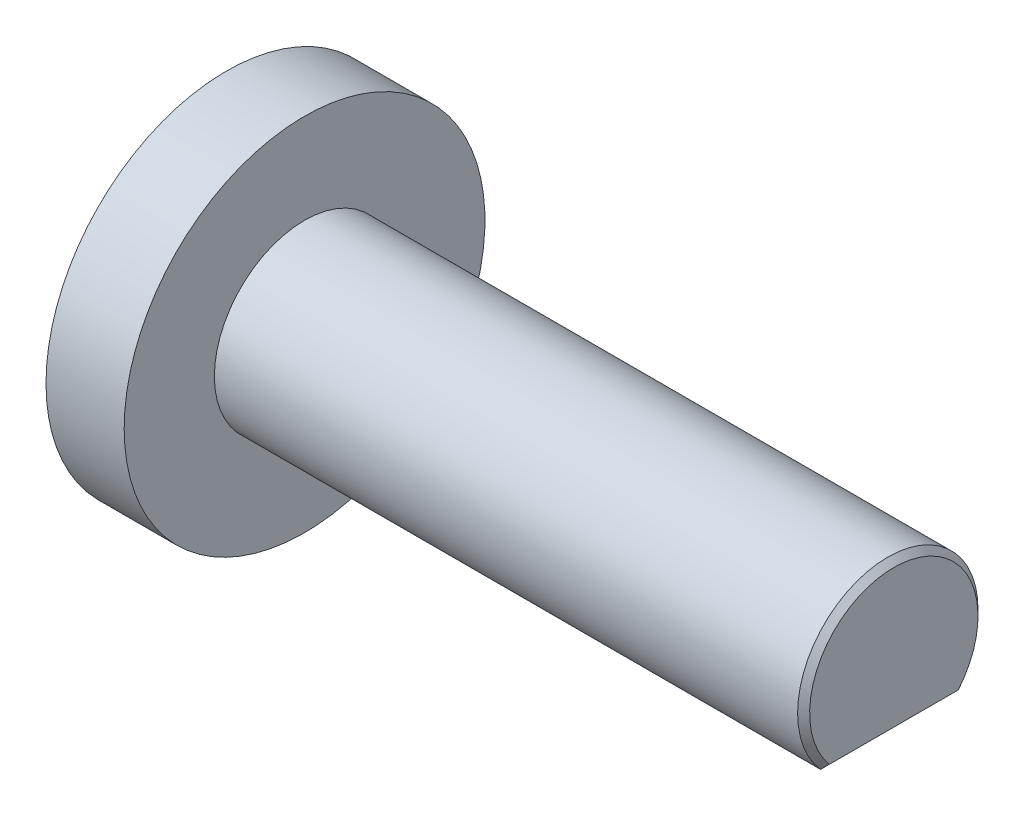
ISO-10303-21;
HEADER;
FILE_DESCRIPTION(('STEP AP214'),'2;1');
FILE_NAME('part.step','',(''),(''),'','','');
FILE_SCHEMA(('AUTOMOTIVE_DESIGN { 1 0 10303 214 1 1 1 1 }'));
ENDSEC;
DATA;
#1=APPLICATION_CONTEXT('core data for automotive mechanical design processes');
#2=APPLICATION_PROTOCOL_DEFINITION('international standard','automotive_design',2000,#1);
#3=PRODUCT_CONTEXT('',#1,'mechanical');
#4=PRODUCT('Part','Part','',(#3));
#5=PRODUCT_RELATED_PRODUCT_CATEGORY('part','',(#4));
#6=PRODUCT_DEFINITION_FORMATION('','',#4);
#7=PRODUCT_DEFINITION_CONTEXT('part definition',#1,'design');
#8=PRODUCT_DEFINITION('design','',#6,#7);
#9=PRODUCT_DEFINITION_SHAPE('','',#8);
#10=(LENGTH_UNIT() NAMED_UNIT(*) SI_UNIT(.MILLI.,.METRE.));
#11=(NAMED_UNIT(*) PLANE_ANGLE_UNIT() SI_UNIT($,.RADIAN.));
#12=(NAMED_UNIT(*) SI_UNIT($,.STERADIAN.) SOLID_ANGLE_UNIT());
#13=UNCERTAINTY_MEASURE_WITH_UNIT(LENGTH_MEASURE(1.E-05),#10,'distance_accuracy_value','');
#14=(GEOMETRIC_REPRESENTATION_CONTEXT(3) GLOBAL_UNCERTAINTY_ASSIGNED_CONTEXT((#13)) GLOBAL_UNIT_ASSIGNED_CONTEXT((#10,
#11,#12)) REPRESENTATION_CONTEXT('',''));
#15=CARTESIAN_POINT('',(0.,0.,0.));
#16=DIRECTION('',(0.,0.,1.));
#17=DIRECTION('',(1.,0.,0.));
#18=AXIS2_PLACEMENT_3D('',#15,#16,#17);
#19=CARTESIAN_POINT('',(0.,0.,0.));
#20=DIRECTION('',(1.,0.,0.));
#21=DIRECTION('',(0.,0.,-1.));
#22=AXIS2_PLACEMENT_3D('',#19,#20,#21);
#23=PLANE('',#22);
#24=CARTESIAN_POINT('',(0.,0.,0.));
#25=DIRECTION('',(-1.,0.,0.));
#26=DIRECTION('',(0.,0.,1.));
#27=AXIS2_PLACEMENT_3D('',#24,#25,#26);
#28=CIRCLE('',#27,3.);
#29=CARTESIAN_POINT('',(0.,0.,3.));
#30=VERTEX_POINT('',#29);
#31=EDGE_CURVE('E82',#30,#30,#28,.T.);
#32=ORIENTED_EDGE('',*,*,#31,.T.);
#33=EDGE_LOOP('',(#32));
#34=FACE_BOUND('',#33,.T.);
#35=ADVANCED_FACE('F33',(#34),#23,.F.);
#36=CARTESIAN_POINT('',(0.,0.,0.));
#37=DIRECTION('',(-1.,0.,0.));
#38=DIRECTION('',(0.,0.,1.));
#39=AXIS2_PLACEMENT_3D('',#36,#37,#38);
#40=CYLINDRICAL_SURFACE('',#39,3.);
#41=ORIENTED_EDGE('',*,*,#31,.F.);
#42=EDGE_LOOP('',(#41));
#43=FACE_BOUND('',#42,.T.);
#44=CARTESIAN_POINT('',(1.3,0.,0.));
#45=DIRECTION('',(-1.,0.,0.));
#46=DIRECTION('',(0.,0.,1.));
#47=AXIS2_PLACEMENT_3D('',#44,#45,#46);
#48=CIRCLE('',#47,3.);
#49=CARTESIAN_POINT('',(1.3,0.,3.));
#50=VERTEX_POINT('',#49);
#51=EDGE_CURVE('E98',#50,#50,#48,.T.);
#52=ORIENTED_EDGE('',*,*,#51,.T.);
#53=EDGE_LOOP('',(#52));
#54=FACE_BOUND('',#53,.T.);
#55=ADVANCED_FACE('F118',(#43,#54),#40,.T.);
#56=CARTESIAN_POINT('',(1.3,3.,0.));
#57=DIRECTION('',(-1.,0.,0.));
#58=DIRECTION('',(0.,0.,1.));
#59=AXIS2_PLACEMENT_3D('',#56,#57,#58);
#60=PLANE('',#59);
#61=ORIENTED_EDGE('',*,*,#51,.F.);
#62=EDGE_LOOP('',(#61));
#63=FACE_BOUND('',#62,.T.);
#64=CARTESIAN_POINT('',(1.3,0.,0.));
#65=DIRECTION('',(-1.,0.,0.));
#66=DIRECTION('',(0.,0.,1.));
#67=AXIS2_PLACEMENT_3D('',#64,#65,#66);
#68=CIRCLE('',#67,1.5);
#69=CARTESIAN_POINT('',(1.3,0.,1.5));
#70=VERTEX_POINT('',#69);
#71=EDGE_CURVE('E93',#70,#70,#68,.T.);
#72=ORIENTED_EDGE('',*,*,#71,.T.);
#73=EDGE_LOOP('',(#72));
#74=FACE_BOUND('',#73,.T.);
#75=ADVANCED_FACE('F122',(#63,#74),#60,.F.);
#76=CARTESIAN_POINT('',(0.,0.,0.));
#77=DIRECTION('',(-1.,0.,0.));
#78=DIRECTION('',(0.,0.,1.));
#79=AXIS2_PLACEMENT_3D('',#76,#77,#78);
#80=CYLINDRICAL_SURFACE('',#79,1.5);
#81=ORIENTED_EDGE('',*,*,#71,.F.);
#82=EDGE_LOOP('',(#81));
#83=FACE_BOUND('',#82,.T.);
#84=DIRECTION('',(1.,0.,0.));
#85=VECTOR('',#84,1.);
#86=CARTESIAN_POINT('',(2.1,-1.,1.1180339887499));
#87=LINE('',#86,#85);
#88=CARTESIAN_POINT('',(2.1,-1.,1.1180339887499));
#89=VERTEX_POINT('',#88);
#90=CARTESIAN_POINT('',(11.,-1.,1.1180339887499));
#91=VERTEX_POINT('',#90);
#92=EDGE_CURVE('E88',#89,#91,#87,.T.);
#93=ORIENTED_EDGE('',*,*,#92,.T.);
#94=CARTESIAN_POINT('',(11.,0.,0.));
#95=DIRECTION('',(-1.,0.,0.));
#96=DIRECTION('',(0.,0.,1.));
#97=AXIS2_PLACEMENT_3D('',#94,#95,#96);
#98=CIRCLE('',#97,1.5);
#99=CARTESIAN_POINT('',(11.,-1.,-1.1180339887499));
#100=VERTEX_POINT('',#99);
#101=EDGE_CURVE('E81',#91,#100,#98,.T.);
#102=ORIENTED_EDGE('',*,*,#101,.T.);
#103=DIRECTION('',(1.,0.,0.));
#104=VECTOR('',#103,1.);
#105=CARTESIAN_POINT('',(2.1,-1.,-1.1180339887499));
#106=LINE('',#105,#104);
#107=CARTESIAN_POINT('',(2.1,-1.,-1.1180339887499));
#108=VERTEX_POINT('',#107);
#109=EDGE_CURVE('E87',#108,#100,#106,.T.);
#110=ORIENTED_EDGE('',*,*,#109,.F.);
#111=CARTESIAN_POINT('',(2.1,0.,0.));
#112=DIRECTION('',(1.,0.,0.));
#113=DIRECTION('',(0.,0.,-1.));
#114=AXIS2_PLACEMENT_3D('',#111,#112,#113);
#115=CIRCLE('',#114,1.5);
#116=EDGE_CURVE('E73',#89,#108,#115,.T.);
#117=ORIENTED_EDGE('',*,*,#116,.F.);
#118=EDGE_LOOP('',(#93,#102,#110,#117));
#119=FACE_BOUND('',#118,.T.);
#120=ADVANCED_FACE('F91',(#83,#119),#80,.T.);
#121=CARTESIAN_POINT('',(11.1,1.5,0.));
#122=DIRECTION('',(-1.,0.,0.));
#123=DIRECTION('',(0.,0.,1.));
#124=AXIS2_PLACEMENT_3D('',#121,#122,#123);
#125=PLANE('',#124);
#126=DIRECTION('',(0.,0.,-1.));
#127=VECTOR('',#126,1.);
#128=CARTESIAN_POINT('',(11.1,-0.900000000000002,0.));
#129=LINE('',#128,#127);
#130=CARTESIAN_POINT('',(11.1,-0.900000000000002,1.07238052947636));
#131=VERTEX_POINT('',#130);
#132=CARTESIAN_POINT('',(11.1,-0.900000000000002,-1.07238052947636));
#133=VERTEX_POINT('',#132);
#134=EDGE_CURVE('E54',#131,#133,#129,.T.);
#135=ORIENTED_EDGE('',*,*,#134,.T.);
#136=CARTESIAN_POINT('',(11.1,0.,0.));
#137=DIRECTION('',(-1.,0.,0.));
#138=DIRECTION('',(0.,0.,1.));
#139=AXIS2_PLACEMENT_3D('',#136,#137,#138);
#140=CIRCLE('',#139,1.4);
#141=EDGE_CURVE('E47',#133,#131,#140,.F.);
#142=ORIENTED_EDGE('',*,*,#141,.T.);
#143=EDGE_LOOP('',(#135,#142));
#144=FACE_BOUND('',#143,.T.);
#145=ADVANCED_FACE('F129',(#144),#125,.F.);
#146=CARTESIAN_POINT('',(2.1,0.,0.));
#147=DIRECTION('',(1.,0.,0.));
#148=DIRECTION('',(0.,0.,-1.));
#149=AXIS2_PLACEMENT_3D('',#146,#147,#148);
#150=PLANE('',#149);
#151=DIRECTION('',(0.,0.,1.));
#152=VECTOR('',#151,1.);
#153=CARTESIAN_POINT('',(2.1,-1.,1.1180339887499));
#154=LINE('',#153,#152);
#155=EDGE_CURVE('E76',#108,#89,#154,.T.);
#156=ORIENTED_EDGE('',*,*,#155,.T.);
#157=ORIENTED_EDGE('',*,*,#116,.T.);
#158=EDGE_LOOP('',(#156,#157));
#159=FACE_BOUND('',#158,.T.);
#160=ADVANCED_FACE('F75',(#159),#150,.T.);
#161=CARTESIAN_POINT('',(2.1,-1.,1.1180339887499));
#162=DIRECTION('',(0.,1.,0.));
#163=DIRECTION('',(0.,0.,1.));
#164=AXIS2_PLACEMENT_3D('',#161,#162,#163);
#165=PLANE('',#164);
#166=ORIENTED_EDGE('',*,*,#109,.T.);
#167=DIRECTION('',(0.,0.,1.));
#168=VECTOR('',#167,1.);
#169=CARTESIAN_POINT('',(11.,-1.,1.1180339887499));
#170=LINE('',#169,#168);
#171=EDGE_CURVE('E11',#100,#91,#170,.T.);
#172=ORIENTED_EDGE('',*,*,#171,.T.);
#173=ORIENTED_EDGE('',*,*,#92,.F.);
#174=ORIENTED_EDGE('',*,*,#155,.F.);
#175=EDGE_LOOP('',(#166,#172,#173,#174));
#176=FACE_BOUND('',#175,.T.);
#177=ADVANCED_FACE('F86',(#176),#165,.F.);
#178=CARTESIAN_POINT('',(11.,-1.,1.1180339887499));
#179=DIRECTION('',(-0.707106781186541,0.707106781186554,0.));
#180=DIRECTION('',(0.,0.,1.));
#181=AXIS2_PLACEMENT_3D('',#178,#179,#180);
#182=PLANE('',#181);
#183=CARTESIAN_POINT('',(11.,-1.,-1.1180339887499));
#184=CARTESIAN_POINT('',(11.0166994423372,-0.983300557662841,-1.11056868928626));
#185=CARTESIAN_POINT('',(11.033382494177,-0.966617505823026,-1.10303158585569));
#186=CARTESIAN_POINT('',(11.0667158275313,-0.933284172468707,-1.08781376618978));
#187=CARTESIAN_POINT('',(11.0833661090248,-0.916633890975189,-1.08013304986251));
#188=CARTESIAN_POINT('',(11.1,-0.899999999999999,-1.07238052947637));
#189=B_SPLINE_CURVE_WITH_KNOTS('',3,(#183,#184,#185,#186,#187,#188),.UNSPECIFIED.,.F.,.F.,(4,2,
4),(0.,0.0743041539183804,0.148608355403508),.UNSPECIFIED.);
#190=EDGE_CURVE('E105',#133,#100,#189,.F.);
#191=ORIENTED_EDGE('',*,*,#190,.F.);
#192=ORIENTED_EDGE('',*,*,#134,.F.);
#193=CARTESIAN_POINT('',(11.1,-0.9,1.07238052947636));
#194=CARTESIAN_POINT('',(11.0833661090248,-0.91663389097519,1.0801330498625));
#195=CARTESIAN_POINT('',(11.0667158275313,-0.933284172468708,1.08781376618978));
#196=CARTESIAN_POINT('',(11.033382494177,-0.966617505823026,1.1030315858557));
#197=CARTESIAN_POINT('',(11.0166994423372,-0.98330055766284,1.11056868928626));
#198=CARTESIAN_POINT('',(11.,-0.999999999999997,1.11803398874991));
#199=B_SPLINE_CURVE_WITH_KNOTS('',3,(#193,#194,#195,#196,#197,#198),.UNSPECIFIED.,.F.,.F.,(4,2,
4),(0.,0.0743042014851276,0.148608355403508),.UNSPECIFIED.);
#200=EDGE_CURVE('E38',#91,#131,#199,.F.);
#201=ORIENTED_EDGE('',*,*,#200,.F.);
#202=ORIENTED_EDGE('',*,*,#171,.F.);
#203=EDGE_LOOP('',(#191,#192,#201,#202));
#204=FACE_BOUND('',#203,.T.);
#205=ADVANCED_FACE('F110',(#204),#182,.F.);
#206=CARTESIAN_POINT('',(11.,0.,0.));
#207=DIRECTION('',(-1.,0.,0.));
#208=DIRECTION('',(0.,0.,1.));
#209=AXIS2_PLACEMENT_3D('',#206,#207,#208);
#210=CONICAL_SURFACE('',#209,1.5,0.78539816339744);
#211=ORIENTED_EDGE('',*,*,#200,.T.);
#212=ORIENTED_EDGE('',*,*,#141,.F.);
#213=ORIENTED_EDGE('',*,*,#190,.T.);
#214=ORIENTED_EDGE('',*,*,#101,.F.);
#215=EDGE_LOOP('',(#211,#212,#213,#214));
#216=FACE_BOUND('',#215,.T.);
#217=ADVANCED_FACE('F35',(#216),#210,.T.);
#218=CLOSED_SHELL('',(#35,#55,#75,#120,#145,#160,#177,#205,#217));
#219=MANIFOLD_SOLID_BREP('B2',#218);
#220=ADVANCED_BREP_SHAPE_REPRESENTATION('',(#18,#219),#14);
#221=SHAPE_DEFINITION_REPRESENTATION(#9,#220);
ENDSEC;
END-ISO-10303-21;
